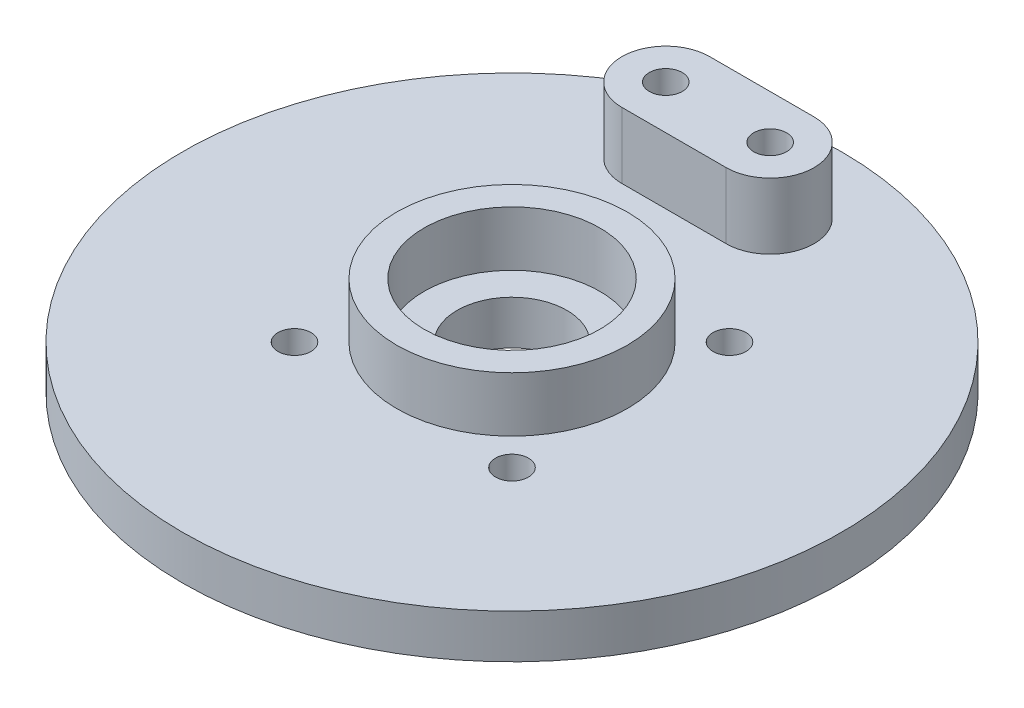
ISO-10303-21;
HEADER;
FILE_DESCRIPTION(('STEP AP214'),'2;1');
FILE_NAME('part.step','',(''),(''),'','','');
FILE_SCHEMA(('AUTOMOTIVE_DESIGN { 1 0 10303 214 1 1 1 1 }'));
ENDSEC;
DATA;
#1=APPLICATION_CONTEXT('core data for automotive mechanical design processes');
#2=APPLICATION_PROTOCOL_DEFINITION('international standard','automotive_design',2000,#1);
#3=PRODUCT_CONTEXT('',#1,'mechanical');
#4=PRODUCT('Part','Part','',(#3));
#5=PRODUCT_RELATED_PRODUCT_CATEGORY('part','',(#4));
#6=PRODUCT_DEFINITION_FORMATION('','',#4);
#7=PRODUCT_DEFINITION_CONTEXT('part definition',#1,'design');
#8=PRODUCT_DEFINITION('design','',#6,#7);
#9=PRODUCT_DEFINITION_SHAPE('','',#8);
#10=(LENGTH_UNIT() NAMED_UNIT(*) SI_UNIT(.MILLI.,.METRE.));
#11=(NAMED_UNIT(*) PLANE_ANGLE_UNIT() SI_UNIT($,.RADIAN.));
#12=(NAMED_UNIT(*) SI_UNIT($,.STERADIAN.) SOLID_ANGLE_UNIT());
#13=UNCERTAINTY_MEASURE_WITH_UNIT(LENGTH_MEASURE(1.E-05),#10,'distance_accuracy_value','');
#14=(GEOMETRIC_REPRESENTATION_CONTEXT(3) GLOBAL_UNCERTAINTY_ASSIGNED_CONTEXT((#13)) GLOBAL_UNIT_ASSIGNED_CONTEXT((#10,
#11,#12)) REPRESENTATION_CONTEXT('',''));
#15=CARTESIAN_POINT('',(0.,0.,0.));
#16=DIRECTION('',(0.,0.,1.));
#17=DIRECTION('',(1.,0.,0.));
#18=AXIS2_PLACEMENT_3D('',#15,#16,#17);
#19=CARTESIAN_POINT('',(0.,4.,0.));
#20=DIRECTION('',(0.,1.,0.));
#21=DIRECTION('',(0.,0.,1.));
#22=AXIS2_PLACEMENT_3D('',#19,#20,#21);
#23=PLANE('',#22);
#24=CARTESIAN_POINT('',(-9.89949493661168,4.,9.89949493661165));
#25=DIRECTION('',(0.,1.,0.));
#26=DIRECTION('',(0.,0.,1.));
#27=AXIS2_PLACEMENT_3D('',#24,#25,#26);
#28=CIRCLE('',#27,1.5);
#29=CARTESIAN_POINT('',(-9.89949493661168,4.,11.3994949366116));
#30=VERTEX_POINT('',#29);
#31=EDGE_CURVE('E170',#30,#30,#28,.T.);
#32=ORIENTED_EDGE('',*,*,#31,.F.);
#33=EDGE_LOOP('',(#32));
#34=FACE_BOUND('',#33,.T.);
#35=CARTESIAN_POINT('',(9.89949493661165,4.,9.89949493661168));
#36=DIRECTION('',(0.,1.,0.));
#37=DIRECTION('',(0.,0.,1.));
#38=AXIS2_PLACEMENT_3D('',#35,#36,#37);
#39=CIRCLE('',#38,1.5);
#40=CARTESIAN_POINT('',(9.89949493661165,4.,11.3994949366117));
#41=VERTEX_POINT('',#40);
#42=EDGE_CURVE('E174',#41,#41,#39,.T.);
#43=ORIENTED_EDGE('',*,*,#42,.F.);
#44=EDGE_LOOP('',(#43));
#45=FACE_BOUND('',#44,.T.);
#46=CARTESIAN_POINT('',(9.89949493661168,4.,-9.89949493661165));
#47=DIRECTION('',(0.,1.,0.));
#48=DIRECTION('',(0.,0.,1.));
#49=AXIS2_PLACEMENT_3D('',#46,#47,#48);
#50=CIRCLE('',#49,1.5);
#51=CARTESIAN_POINT('',(9.89949493661168,4.,-8.39949493661165));
#52=VERTEX_POINT('',#51);
#53=EDGE_CURVE('E178',#52,#52,#50,.T.);
#54=ORIENTED_EDGE('',*,*,#53,.F.);
#55=EDGE_LOOP('',(#54));
#56=FACE_BOUND('',#55,.T.);
#57=CARTESIAN_POINT('',(-9.89949493661165,4.,-9.89949493661168));
#58=DIRECTION('',(0.,1.,0.));
#59=DIRECTION('',(0.,0.,1.));
#60=AXIS2_PLACEMENT_3D('',#57,#58,#59);
#61=CIRCLE('',#60,1.5);
#62=CARTESIAN_POINT('',(-9.89949493661165,4.,-8.39949493661168));
#63=VERTEX_POINT('',#62);
#64=EDGE_CURVE('E182',#63,#63,#61,.T.);
#65=ORIENTED_EDGE('',*,*,#64,.F.);
#66=EDGE_LOOP('',(#65));
#67=FACE_BOUND('',#66,.T.);
#68=CARTESIAN_POINT('',(0.,4.,0.));
#69=DIRECTION('',(0.,1.,0.));
#70=DIRECTION('',(0.,0.,1.));
#71=AXIS2_PLACEMENT_3D('',#68,#69,#70);
#72=CIRCLE('',#71,30.);
#73=CARTESIAN_POINT('',(0.,4.,30.));
#74=VERTEX_POINT('',#73);
#75=EDGE_CURVE('E41',#74,#74,#72,.T.);
#76=ORIENTED_EDGE('',*,*,#75,.T.);
#77=EDGE_LOOP('',(#76));
#78=FACE_BOUND('',#77,.T.);
#79=CARTESIAN_POINT('',(0.,4.,0.));
#80=DIRECTION('',(0.,1.,0.));
#81=DIRECTION('',(0.,0.,1.));
#82=AXIS2_PLACEMENT_3D('',#79,#80,#81);
#83=CIRCLE('',#82,10.5);
#84=CARTESIAN_POINT('',(0.,4.,10.5));
#85=VERTEX_POINT('',#84);
#86=EDGE_CURVE('E121',#85,#85,#83,.T.);
#87=ORIENTED_EDGE('',*,*,#86,.F.);
#88=EDGE_LOOP('',(#87));
#89=FACE_BOUND('',#88,.T.);
#90=DIRECTION('',(-1.,0.,0.));
#91=VECTOR('',#90,1.);
#92=CARTESIAN_POINT('',(2.,4.,-25.5));
#93=LINE('',#92,#91);
#94=CARTESIAN_POINT('',(2.,4.,-25.5));
#95=VERTEX_POINT('',#94);
#96=CARTESIAN_POINT('',(-7.5,4.,-25.5));
#97=VERTEX_POINT('',#96);
#98=EDGE_CURVE('E90',#95,#97,#93,.T.);
#99=ORIENTED_EDGE('',*,*,#98,.F.);
#100=CARTESIAN_POINT('',(2.,4.,-21.5));
#101=DIRECTION('',(0.,1.,0.));
#102=DIRECTION('',(0.,0.,1.));
#103=AXIS2_PLACEMENT_3D('',#100,#101,#102);
#104=CIRCLE('',#103,4.);
#105=CARTESIAN_POINT('',(2.,4.,-17.5));
#106=VERTEX_POINT('',#105);
#107=EDGE_CURVE('E101',#106,#95,#104,.T.);
#108=ORIENTED_EDGE('',*,*,#107,.F.);
#109=DIRECTION('',(1.,0.,0.));
#110=VECTOR('',#109,1.);
#111=CARTESIAN_POINT('',(-7.5,4.,-17.5));
#112=LINE('',#111,#110);
#113=CARTESIAN_POINT('',(-7.5,4.,-17.5));
#114=VERTEX_POINT('',#113);
#115=EDGE_CURVE('E70',#114,#106,#112,.T.);
#116=ORIENTED_EDGE('',*,*,#115,.F.);
#117=CARTESIAN_POINT('',(-7.5,4.,-21.5));
#118=DIRECTION('',(0.,1.,0.));
#119=DIRECTION('',(0.,0.,1.));
#120=AXIS2_PLACEMENT_3D('',#117,#118,#119);
#121=CIRCLE('',#120,4.);
#122=EDGE_CURVE('E106',#97,#114,#121,.T.);
#123=ORIENTED_EDGE('',*,*,#122,.F.);
#124=EDGE_LOOP('',(#99,#108,#116,#123));
#125=FACE_BOUND('',#124,.T.);
#126=ADVANCED_FACE('F33',(#34,#45,#56,#67,#78,#89,#125),#23,.T.);
#127=CARTESIAN_POINT('',(0.,4.,0.));
#128=DIRECTION('',(0.,1.,0.));
#129=DIRECTION('',(0.,0.,1.));
#130=AXIS2_PLACEMENT_3D('',#127,#128,#129);
#131=CIRCLE('',#130,5.);
#132=CARTESIAN_POINT('',(0.,4.,5.));
#133=VERTEX_POINT('',#132);
#134=EDGE_CURVE('E128',#133,#133,#131,.T.);
#135=ORIENTED_EDGE('',*,*,#134,.F.);
#136=EDGE_LOOP('',(#135));
#137=FACE_BOUND('',#136,.T.);
#138=CARTESIAN_POINT('',(0.,4.,0.));
#139=DIRECTION('',(0.,1.,0.));
#140=DIRECTION('',(0.,0.,1.));
#141=AXIS2_PLACEMENT_3D('',#138,#139,#140);
#142=CIRCLE('',#141,8.);
#143=CARTESIAN_POINT('',(0.,4.,8.));
#144=VERTEX_POINT('',#143);
#145=EDGE_CURVE('E11',#144,#144,#142,.F.);
#146=ORIENTED_EDGE('',*,*,#145,.F.);
#147=EDGE_LOOP('',(#146));
#148=FACE_BOUND('',#147,.T.);
#149=ADVANCED_FACE('F142',(#137,#148),#23,.T.);
#150=CARTESIAN_POINT('',(0.,0.,0.));
#151=DIRECTION('',(0.,1.,0.));
#152=DIRECTION('',(0.,0.,1.));
#153=AXIS2_PLACEMENT_3D('',#150,#151,#152);
#154=PLANE('',#153);
#155=CARTESIAN_POINT('',(-9.89949493661168,0.,9.89949493661165));
#156=DIRECTION('',(0.,1.,0.));
#157=DIRECTION('',(0.,0.,1.));
#158=AXIS2_PLACEMENT_3D('',#155,#156,#157);
#159=CIRCLE('',#158,1.5);
#160=CARTESIAN_POINT('',(-9.89949493661168,0.,11.3994949366116));
#161=VERTEX_POINT('',#160);
#162=EDGE_CURVE('E320',#161,#161,#159,.T.);
#163=ORIENTED_EDGE('',*,*,#162,.T.);
#164=EDGE_LOOP('',(#163));
#165=FACE_BOUND('',#164,.T.);
#166=CARTESIAN_POINT('',(9.89949493661165,0.,9.89949493661168));
#167=DIRECTION('',(0.,1.,0.));
#168=DIRECTION('',(0.,0.,1.));
#169=AXIS2_PLACEMENT_3D('',#166,#167,#168);
#170=CIRCLE('',#169,1.5);
#171=CARTESIAN_POINT('',(9.89949493661165,0.,11.3994949366117));
#172=VERTEX_POINT('',#171);
#173=EDGE_CURVE('E343',#172,#172,#170,.T.);
#174=ORIENTED_EDGE('',*,*,#173,.T.);
#175=EDGE_LOOP('',(#174));
#176=FACE_BOUND('',#175,.T.);
#177=CARTESIAN_POINT('',(9.89949493661168,0.,-9.89949493661165));
#178=DIRECTION('',(0.,1.,0.));
#179=DIRECTION('',(0.,0.,1.));
#180=AXIS2_PLACEMENT_3D('',#177,#178,#179);
#181=CIRCLE('',#180,1.5);
#182=CARTESIAN_POINT('',(9.89949493661168,0.,-8.39949493661165));
#183=VERTEX_POINT('',#182);
#184=EDGE_CURVE('E330',#183,#183,#181,.T.);
#185=ORIENTED_EDGE('',*,*,#184,.T.);
#186=EDGE_LOOP('',(#185));
#187=FACE_BOUND('',#186,.T.);
#188=CARTESIAN_POINT('',(-9.89949493661165,0.,-9.89949493661168));
#189=DIRECTION('',(0.,1.,0.));
#190=DIRECTION('',(0.,0.,1.));
#191=AXIS2_PLACEMENT_3D('',#188,#189,#190);
#192=CIRCLE('',#191,1.5);
#193=CARTESIAN_POINT('',(-9.89949493661165,0.,-8.39949493661168));
#194=VERTEX_POINT('',#193);
#195=EDGE_CURVE('E325',#194,#194,#192,.T.);
#196=ORIENTED_EDGE('',*,*,#195,.T.);
#197=EDGE_LOOP('',(#196));
#198=FACE_BOUND('',#197,.T.);
#199=CARTESIAN_POINT('',(-7.5,0.,-21.5));
#200=DIRECTION('',(0.,1.,0.));
#201=DIRECTION('',(0.,0.,1.));
#202=AXIS2_PLACEMENT_3D('',#199,#200,#201);
#203=CIRCLE('',#202,1.5);
#204=CARTESIAN_POINT('',(-7.5,0.,-20.));
#205=VERTEX_POINT('',#204);
#206=EDGE_CURVE('E113',#205,#205,#203,.T.);
#207=ORIENTED_EDGE('',*,*,#206,.T.);
#208=EDGE_LOOP('',(#207));
#209=FACE_BOUND('',#208,.T.);
#210=CARTESIAN_POINT('',(2.,0.,-21.5));
#211=DIRECTION('',(0.,1.,0.));
#212=DIRECTION('',(0.,0.,1.));
#213=AXIS2_PLACEMENT_3D('',#210,#211,#212);
#214=CIRCLE('',#213,1.5);
#215=CARTESIAN_POINT('',(2.,0.,-20.));
#216=VERTEX_POINT('',#215);
#217=EDGE_CURVE('E112',#216,#216,#214,.T.);
#218=ORIENTED_EDGE('',*,*,#217,.T.);
#219=EDGE_LOOP('',(#218));
#220=FACE_BOUND('',#219,.T.);
#221=CARTESIAN_POINT('',(0.,0.,0.));
#222=DIRECTION('',(0.,1.,0.));
#223=DIRECTION('',(0.,0.,1.));
#224=AXIS2_PLACEMENT_3D('',#221,#222,#223);
#225=CIRCLE('',#224,30.);
#226=CARTESIAN_POINT('',(0.,0.,30.));
#227=VERTEX_POINT('',#226);
#228=EDGE_CURVE('E131',#227,#227,#225,.T.);
#229=ORIENTED_EDGE('',*,*,#228,.F.);
#230=EDGE_LOOP('',(#229));
#231=FACE_BOUND('',#230,.T.);
#232=CARTESIAN_POINT('',(0.,0.,0.));
#233=DIRECTION('',(0.,1.,0.));
#234=DIRECTION('',(0.,0.,1.));
#235=AXIS2_PLACEMENT_3D('',#232,#233,#234);
#236=CIRCLE('',#235,5.);
#237=CARTESIAN_POINT('',(0.,0.,5.));
#238=VERTEX_POINT('',#237);
#239=EDGE_CURVE('E125',#238,#238,#236,.T.);
#240=ORIENTED_EDGE('',*,*,#239,.T.);
#241=EDGE_LOOP('',(#240));
#242=FACE_BOUND('',#241,.T.);
#243=ADVANCED_FACE('F139',(#165,#176,#187,#198,#209,#220,#231,#242),#154,.F.);
#244=CARTESIAN_POINT('',(0.,4.,0.));
#245=DIRECTION('',(0.,-1.,0.));
#246=DIRECTION('',(0.,0.,-1.));
#247=AXIS2_PLACEMENT_3D('',#244,#245,#246);
#248=CYLINDRICAL_SURFACE('',#247,30.);
#249=ORIENTED_EDGE('',*,*,#75,.F.);
#250=EDGE_LOOP('',(#249));
#251=FACE_BOUND('',#250,.T.);
#252=ORIENTED_EDGE('',*,*,#228,.T.);
#253=EDGE_LOOP('',(#252));
#254=FACE_BOUND('',#253,.T.);
#255=ADVANCED_FACE('F35',(#251,#254),#248,.T.);
#256=CARTESIAN_POINT('',(0.,4.,0.));
#257=DIRECTION('',(0.,-1.,0.));
#258=DIRECTION('',(0.,0.,-1.));
#259=AXIS2_PLACEMENT_3D('',#256,#257,#258);
#260=CYLINDRICAL_SURFACE('',#259,5.);
#261=ORIENTED_EDGE('',*,*,#134,.T.);
#262=EDGE_LOOP('',(#261));
#263=FACE_BOUND('',#262,.T.);
#264=ORIENTED_EDGE('',*,*,#239,.F.);
#265=EDGE_LOOP('',(#264));
#266=FACE_BOUND('',#265,.T.);
#267=ADVANCED_FACE('F146',(#263,#266),#260,.F.);
#268=CARTESIAN_POINT('',(0.,9.,0.));
#269=DIRECTION('',(0.,1.,0.));
#270=DIRECTION('',(0.,0.,1.));
#271=AXIS2_PLACEMENT_3D('',#268,#269,#270);
#272=PLANE('',#271);
#273=CARTESIAN_POINT('',(0.,9.,0.));
#274=DIRECTION('',(0.,1.,0.));
#275=DIRECTION('',(0.,0.,1.));
#276=AXIS2_PLACEMENT_3D('',#273,#274,#275);
#277=CIRCLE('',#276,10.5);
#278=CARTESIAN_POINT('',(0.,9.,10.5));
#279=VERTEX_POINT('',#278);
#280=EDGE_CURVE('E122',#279,#279,#277,.T.);
#281=ORIENTED_EDGE('',*,*,#280,.T.);
#282=EDGE_LOOP('',(#281));
#283=FACE_BOUND('',#282,.T.);
#284=CARTESIAN_POINT('',(0.,9.,0.));
#285=DIRECTION('',(0.,1.,0.));
#286=DIRECTION('',(0.,0.,1.));
#287=AXIS2_PLACEMENT_3D('',#284,#285,#286);
#288=CIRCLE('',#287,8.);
#289=CARTESIAN_POINT('',(0.,9.,8.));
#290=VERTEX_POINT('',#289);
#291=EDGE_CURVE('E116',#290,#290,#288,.T.);
#292=ORIENTED_EDGE('',*,*,#291,.F.);
#293=EDGE_LOOP('',(#292));
#294=FACE_BOUND('',#293,.T.);
#295=ADVANCED_FACE('F148',(#283,#294),#272,.T.);
#296=CARTESIAN_POINT('',(0.,9.,0.));
#297=DIRECTION('',(0.,-1.,0.));
#298=DIRECTION('',(0.,0.,-1.));
#299=AXIS2_PLACEMENT_3D('',#296,#297,#298);
#300=CYLINDRICAL_SURFACE('',#299,10.5);
#301=ORIENTED_EDGE('',*,*,#280,.F.);
#302=EDGE_LOOP('',(#301));
#303=FACE_BOUND('',#302,.T.);
#304=ORIENTED_EDGE('',*,*,#86,.T.);
#305=EDGE_LOOP('',(#304));
#306=FACE_BOUND('',#305,.T.);
#307=ADVANCED_FACE('F155',(#303,#306),#300,.T.);
#308=CARTESIAN_POINT('',(0.,9.,0.));
#309=DIRECTION('',(0.,-1.,0.));
#310=DIRECTION('',(0.,0.,-1.));
#311=AXIS2_PLACEMENT_3D('',#308,#309,#310);
#312=CYLINDRICAL_SURFACE('',#311,8.);
#313=ORIENTED_EDGE('',*,*,#291,.T.);
#314=EDGE_LOOP('',(#313));
#315=FACE_BOUND('',#314,.T.);
#316=ORIENTED_EDGE('',*,*,#145,.T.);
#317=EDGE_LOOP('',(#316));
#318=FACE_BOUND('',#317,.T.);
#319=ADVANCED_FACE('F215',(#315,#318),#312,.F.);
#320=CARTESIAN_POINT('',(2.,0.,-21.5));
#321=DIRECTION('',(0.,1.,0.));
#322=DIRECTION('',(0.,0.,1.));
#323=AXIS2_PLACEMENT_3D('',#320,#321,#322);
#324=CYLINDRICAL_SURFACE('',#323,1.5);
#325=ORIENTED_EDGE('',*,*,#217,.F.);
#326=EDGE_LOOP('',(#325));
#327=FACE_BOUND('',#326,.T.);
#328=CARTESIAN_POINT('',(2.,10.,-21.5));
#329=DIRECTION('',(0.,1.,0.));
#330=DIRECTION('',(0.,0.,1.));
#331=AXIS2_PLACEMENT_3D('',#328,#329,#330);
#332=CIRCLE('',#331,1.5);
#333=CARTESIAN_POINT('',(2.,10.,-20.));
#334=VERTEX_POINT('',#333);
#335=EDGE_CURVE('E328',#334,#334,#332,.T.);
#336=ORIENTED_EDGE('',*,*,#335,.T.);
#337=EDGE_LOOP('',(#336));
#338=FACE_BOUND('',#337,.T.);
#339=ADVANCED_FACE('F211',(#327,#338),#324,.F.);
#340=CARTESIAN_POINT('',(-7.5,0.,-21.5));
#341=DIRECTION('',(0.,1.,0.));
#342=DIRECTION('',(0.,0.,1.));
#343=AXIS2_PLACEMENT_3D('',#340,#341,#342);
#344=CYLINDRICAL_SURFACE('',#343,1.5);
#345=ORIENTED_EDGE('',*,*,#206,.F.);
#346=EDGE_LOOP('',(#345));
#347=FACE_BOUND('',#346,.T.);
#348=CARTESIAN_POINT('',(-7.5,10.,-21.5));
#349=DIRECTION('',(0.,1.,0.));
#350=DIRECTION('',(0.,0.,1.));
#351=AXIS2_PLACEMENT_3D('',#348,#349,#350);
#352=CIRCLE('',#351,1.5);
#353=CARTESIAN_POINT('',(-7.5,10.,-20.));
#354=VERTEX_POINT('',#353);
#355=EDGE_CURVE('E104',#354,#354,#352,.T.);
#356=ORIENTED_EDGE('',*,*,#355,.T.);
#357=EDGE_LOOP('',(#356));
#358=FACE_BOUND('',#357,.T.);
#359=ADVANCED_FACE('F208',(#347,#358),#344,.F.);
#360=CARTESIAN_POINT('',(2.,10.,-21.5));
#361=DIRECTION('',(0.,1.,0.));
#362=DIRECTION('',(0.,0.,1.));
#363=AXIS2_PLACEMENT_3D('',#360,#361,#362);
#364=PLANE('',#363);
#365=ORIENTED_EDGE('',*,*,#355,.F.);
#366=EDGE_LOOP('',(#365));
#367=FACE_BOUND('',#366,.T.);
#368=CARTESIAN_POINT('',(2.,10.,-21.5));
#369=DIRECTION('',(0.,1.,0.));
#370=DIRECTION('',(0.,0.,1.));
#371=AXIS2_PLACEMENT_3D('',#368,#369,#370);
#372=CIRCLE('',#371,4.);
#373=CARTESIAN_POINT('',(2.,10.,-17.5));
#374=VERTEX_POINT('',#373);
#375=CARTESIAN_POINT('',(2.,10.,-25.5));
#376=VERTEX_POINT('',#375);
#377=EDGE_CURVE('E83',#374,#376,#372,.T.);
#378=ORIENTED_EDGE('',*,*,#377,.T.);
#379=DIRECTION('',(-1.,0.,0.));
#380=VECTOR('',#379,1.);
#381=CARTESIAN_POINT('',(2.,10.,-25.5));
#382=LINE('',#381,#380);
#383=CARTESIAN_POINT('',(-7.5,10.,-25.5));
#384=VERTEX_POINT('',#383);
#385=EDGE_CURVE('E77',#376,#384,#382,.T.);
#386=ORIENTED_EDGE('',*,*,#385,.T.);
#387=CARTESIAN_POINT('',(-7.5,10.,-21.5));
#388=DIRECTION('',(0.,1.,0.));
#389=DIRECTION('',(0.,0.,1.));
#390=AXIS2_PLACEMENT_3D('',#387,#388,#389);
#391=CIRCLE('',#390,4.);
#392=CARTESIAN_POINT('',(-7.5,10.,-17.5));
#393=VERTEX_POINT('',#392);
#394=EDGE_CURVE('E81',#384,#393,#391,.T.);
#395=ORIENTED_EDGE('',*,*,#394,.T.);
#396=DIRECTION('',(1.,0.,0.));
#397=VECTOR('',#396,1.);
#398=CARTESIAN_POINT('',(-7.5,10.,-17.5));
#399=LINE('',#398,#397);
#400=EDGE_CURVE('E56',#393,#374,#399,.T.);
#401=ORIENTED_EDGE('',*,*,#400,.T.);
#402=EDGE_LOOP('',(#378,#386,#395,#401));
#403=FACE_BOUND('',#402,.T.);
#404=ORIENTED_EDGE('',*,*,#335,.F.);
#405=EDGE_LOOP('',(#404));
#406=FACE_BOUND('',#405,.T.);
#407=ADVANCED_FACE('F78',(#367,#403,#406),#364,.T.);
#408=CARTESIAN_POINT('',(2.,10.,-21.5));
#409=DIRECTION('',(0.,-1.,0.));
#410=DIRECTION('',(0.,0.,-1.));
#411=AXIS2_PLACEMENT_3D('',#408,#409,#410);
#412=CYLINDRICAL_SURFACE('',#411,4.);
#413=ORIENTED_EDGE('',*,*,#107,.T.);
#414=DIRECTION('',(0.,-1.,0.));
#415=VECTOR('',#414,1.);
#416=CARTESIAN_POINT('',(2.,10.,-25.5));
#417=LINE('',#416,#415);
#418=EDGE_CURVE('E93',#376,#95,#417,.T.);
#419=ORIENTED_EDGE('',*,*,#418,.F.);
#420=ORIENTED_EDGE('',*,*,#377,.F.);
#421=DIRECTION('',(0.,-1.,0.));
#422=VECTOR('',#421,1.);
#423=CARTESIAN_POINT('',(2.,10.,-17.5));
#424=LINE('',#423,#422);
#425=EDGE_CURVE('E97',#374,#106,#424,.T.);
#426=ORIENTED_EDGE('',*,*,#425,.T.);
#427=EDGE_LOOP('',(#413,#419,#420,#426));
#428=FACE_BOUND('',#427,.T.);
#429=ADVANCED_FACE('F189',(#428),#412,.T.);
#430=CARTESIAN_POINT('',(2.,10.,-25.5));
#431=DIRECTION('',(0.,0.,1.));
#432=DIRECTION('',(1.,0.,0.));
#433=AXIS2_PLACEMENT_3D('',#430,#431,#432);
#434=PLANE('',#433);
#435=ORIENTED_EDGE('',*,*,#98,.T.);
#436=DIRECTION('',(0.,-1.,0.));
#437=VECTOR('',#436,1.);
#438=CARTESIAN_POINT('',(-7.5,10.,-25.5));
#439=LINE('',#438,#437);
#440=EDGE_CURVE('E87',#384,#97,#439,.T.);
#441=ORIENTED_EDGE('',*,*,#440,.F.);
#442=ORIENTED_EDGE('',*,*,#385,.F.);
#443=ORIENTED_EDGE('',*,*,#418,.T.);
#444=EDGE_LOOP('',(#435,#441,#442,#443));
#445=FACE_BOUND('',#444,.T.);
#446=ADVANCED_FACE('F88',(#445),#434,.F.);
#447=CARTESIAN_POINT('',(-7.5,10.,-21.5));
#448=DIRECTION('',(0.,-1.,0.));
#449=DIRECTION('',(0.,0.,-1.));
#450=AXIS2_PLACEMENT_3D('',#447,#448,#449);
#451=CYLINDRICAL_SURFACE('',#450,4.);
#452=ORIENTED_EDGE('',*,*,#122,.T.);
#453=DIRECTION('',(0.,-1.,0.));
#454=VECTOR('',#453,1.);
#455=CARTESIAN_POINT('',(-7.5,10.,-17.5));
#456=LINE('',#455,#454);
#457=EDGE_CURVE('E48',#393,#114,#456,.T.);
#458=ORIENTED_EDGE('',*,*,#457,.F.);
#459=ORIENTED_EDGE('',*,*,#394,.F.);
#460=ORIENTED_EDGE('',*,*,#440,.T.);
#461=EDGE_LOOP('',(#452,#458,#459,#460));
#462=FACE_BOUND('',#461,.T.);
#463=ADVANCED_FACE('F95',(#462),#451,.T.);
#464=CARTESIAN_POINT('',(-7.5,10.,-17.5));
#465=DIRECTION('',(0.,0.,-1.));
#466=DIRECTION('',(-1.,0.,0.));
#467=AXIS2_PLACEMENT_3D('',#464,#465,#466);
#468=PLANE('',#467);
#469=ORIENTED_EDGE('',*,*,#115,.T.);
#470=ORIENTED_EDGE('',*,*,#425,.F.);
#471=ORIENTED_EDGE('',*,*,#400,.F.);
#472=ORIENTED_EDGE('',*,*,#457,.T.);
#473=EDGE_LOOP('',(#469,#470,#471,#472));
#474=FACE_BOUND('',#473,.T.);
#475=ADVANCED_FACE('F190',(#474),#468,.F.);
#476=CARTESIAN_POINT('',(-9.89949493661165,0.,-9.89949493661168));
#477=DIRECTION('',(0.,1.,0.));
#478=DIRECTION('',(0.,0.,1.));
#479=AXIS2_PLACEMENT_3D('',#476,#477,#478);
#480=CYLINDRICAL_SURFACE('',#479,1.5);
#481=ORIENTED_EDGE('',*,*,#195,.F.);
#482=EDGE_LOOP('',(#481));
#483=FACE_BOUND('',#482,.T.);
#484=ORIENTED_EDGE('',*,*,#64,.T.);
#485=EDGE_LOOP('',(#484));
#486=FACE_BOUND('',#485,.T.);
#487=ADVANCED_FACE('F192',(#483,#486),#480,.F.);
#488=CARTESIAN_POINT('',(9.89949493661168,0.,-9.89949493661165));
#489=DIRECTION('',(0.,1.,0.));
#490=DIRECTION('',(0.,0.,1.));
#491=AXIS2_PLACEMENT_3D('',#488,#489,#490);
#492=CYLINDRICAL_SURFACE('',#491,1.5);
#493=ORIENTED_EDGE('',*,*,#184,.F.);
#494=EDGE_LOOP('',(#493));
#495=FACE_BOUND('',#494,.T.);
#496=ORIENTED_EDGE('',*,*,#53,.T.);
#497=EDGE_LOOP('',(#496));
#498=FACE_BOUND('',#497,.T.);
#499=ADVANCED_FACE('F198',(#495,#498),#492,.F.);
#500=CARTESIAN_POINT('',(9.89949493661165,0.,9.89949493661168));
#501=DIRECTION('',(0.,1.,0.));
#502=DIRECTION('',(0.,0.,1.));
#503=AXIS2_PLACEMENT_3D('',#500,#501,#502);
#504=CYLINDRICAL_SURFACE('',#503,1.5);
#505=ORIENTED_EDGE('',*,*,#173,.F.);
#506=EDGE_LOOP('',(#505));
#507=FACE_BOUND('',#506,.T.);
#508=ORIENTED_EDGE('',*,*,#42,.T.);
#509=EDGE_LOOP('',(#508));
#510=FACE_BOUND('',#509,.T.);
#511=ADVANCED_FACE('F293',(#507,#510),#504,.F.);
#512=CARTESIAN_POINT('',(-9.89949493661168,0.,9.89949493661165));
#513=DIRECTION('',(0.,1.,0.));
#514=DIRECTION('',(0.,0.,1.));
#515=AXIS2_PLACEMENT_3D('',#512,#513,#514);
#516=CYLINDRICAL_SURFACE('',#515,1.5);
#517=ORIENTED_EDGE('',*,*,#162,.F.);
#518=EDGE_LOOP('',(#517));
#519=FACE_BOUND('',#518,.T.);
#520=ORIENTED_EDGE('',*,*,#31,.T.);
#521=EDGE_LOOP('',(#520));
#522=FACE_BOUND('',#521,.T.);
#523=ADVANCED_FACE('F303',(#519,#522),#516,.F.);
#524=CLOSED_SHELL('',(#126,#149,#243,#255,#267,#295,#307,#319,#339,#359,#407,#429,#446,#463,
#475,#487,#499,#511,#523));
#525=MANIFOLD_SOLID_BREP('B2',#524);
#526=ADVANCED_BREP_SHAPE_REPRESENTATION('',(#18,#525),#14);
#527=SHAPE_DEFINITION_REPRESENTATION(#9,#526);
ENDSEC;
END-ISO-10303-21;
